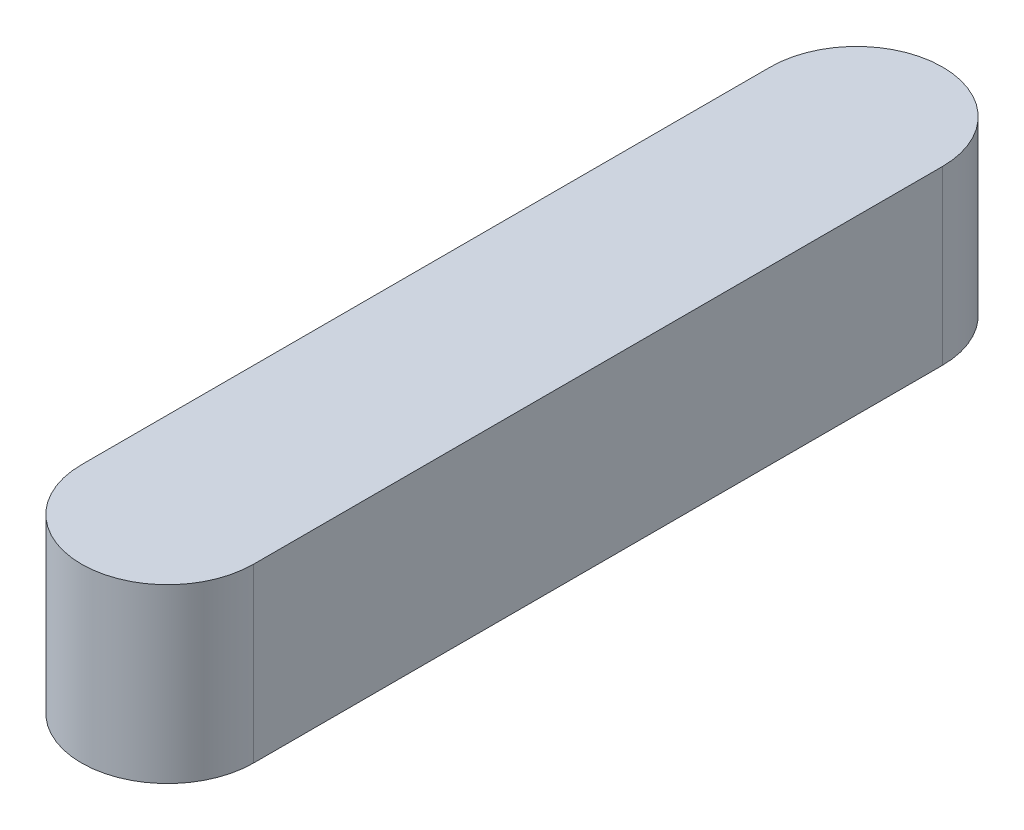
ISO-10303-21;
HEADER;
FILE_DESCRIPTION(('STEP AP214'),'2;1');
FILE_NAME('part.step','',(''),(''),'','','');
FILE_SCHEMA(('AUTOMOTIVE_DESIGN { 1 0 10303 214 1 1 1 1 }'));
ENDSEC;
DATA;
#1=APPLICATION_CONTEXT('core data for automotive mechanical design processes');
#2=APPLICATION_PROTOCOL_DEFINITION('international standard','automotive_design',2000,#1);
#3=PRODUCT_CONTEXT('',#1,'mechanical');
#4=PRODUCT('Part','Part','',(#3));
#5=PRODUCT_RELATED_PRODUCT_CATEGORY('part','',(#4));
#6=PRODUCT_DEFINITION_FORMATION('','',#4);
#7=PRODUCT_DEFINITION_CONTEXT('part definition',#1,'design');
#8=PRODUCT_DEFINITION('design','',#6,#7);
#9=PRODUCT_DEFINITION_SHAPE('','',#8);
#10=(LENGTH_UNIT() NAMED_UNIT(*) SI_UNIT(.MILLI.,.METRE.));
#11=(NAMED_UNIT(*) PLANE_ANGLE_UNIT() SI_UNIT($,.RADIAN.));
#12=(NAMED_UNIT(*) SI_UNIT($,.STERADIAN.) SOLID_ANGLE_UNIT());
#13=UNCERTAINTY_MEASURE_WITH_UNIT(LENGTH_MEASURE(1.E-05),#10,'distance_accuracy_value','');
#14=(GEOMETRIC_REPRESENTATION_CONTEXT(3) GLOBAL_UNCERTAINTY_ASSIGNED_CONTEXT((#13)) GLOBAL_UNIT_ASSIGNED_CONTEXT((#10,
#11,#12)) REPRESENTATION_CONTEXT('',''));
#15=CARTESIAN_POINT('',(0.,0.,0.));
#16=DIRECTION('',(0.,0.,1.));
#17=DIRECTION('',(1.,0.,0.));
#18=AXIS2_PLACEMENT_3D('',#15,#16,#17);
#19=CARTESIAN_POINT('',(0.,-2.,8.));
#20=DIRECTION('',(0.,1.,0.));
#21=DIRECTION('',(0.,0.,1.));
#22=AXIS2_PLACEMENT_3D('',#19,#20,#21);
#23=CYLINDRICAL_SURFACE('',#22,2.);
#24=CARTESIAN_POINT('',(0.,2.,8.));
#25=DIRECTION('',(0.,1.,0.));
#26=DIRECTION('',(0.,0.,1.));
#27=AXIS2_PLACEMENT_3D('',#24,#25,#26);
#28=CIRCLE('',#27,2.);
#29=CARTESIAN_POINT('',(-2.,2.,8.));
#30=VERTEX_POINT('',#29);
#31=CARTESIAN_POINT('',(2.,2.,8.));
#32=VERTEX_POINT('',#31);
#33=EDGE_CURVE('E101',#30,#32,#28,.T.);
#34=ORIENTED_EDGE('',*,*,#33,.F.);
#35=DIRECTION('',(0.,1.,0.));
#36=VECTOR('',#35,1.);
#37=CARTESIAN_POINT('',(-2.,-2.,8.));
#38=LINE('',#37,#36);
#39=CARTESIAN_POINT('',(-2.,-2.,8.));
#40=VERTEX_POINT('',#39);
#41=EDGE_CURVE('E11',#40,#30,#38,.T.);
#42=ORIENTED_EDGE('',*,*,#41,.F.);
#43=CARTESIAN_POINT('',(0.,-2.,8.));
#44=DIRECTION('',(0.,1.,0.));
#45=DIRECTION('',(0.,0.,1.));
#46=AXIS2_PLACEMENT_3D('',#43,#44,#45);
#47=CIRCLE('',#46,2.);
#48=CARTESIAN_POINT('',(2.,-2.,8.));
#49=VERTEX_POINT('',#48);
#50=EDGE_CURVE('E95',#40,#49,#47,.T.);
#51=ORIENTED_EDGE('',*,*,#50,.T.);
#52=DIRECTION('',(0.,1.,0.));
#53=VECTOR('',#52,1.);
#54=CARTESIAN_POINT('',(2.,-2.,8.));
#55=LINE('',#54,#53);
#56=EDGE_CURVE('E40',#49,#32,#55,.T.);
#57=ORIENTED_EDGE('',*,*,#56,.T.);
#58=EDGE_LOOP('',(#34,#42,#51,#57));
#59=FACE_BOUND('',#58,.T.);
#60=ADVANCED_FACE('F37',(#59),#23,.T.);
#61=CARTESIAN_POINT('',(-2.,-2.,8.));
#62=DIRECTION('',(-1.,0.,0.));
#63=DIRECTION('',(0.,0.,1.));
#64=AXIS2_PLACEMENT_3D('',#61,#62,#63);
#65=PLANE('',#64);
#66=DIRECTION('',(0.,0.,1.));
#67=VECTOR('',#66,1.);
#68=CARTESIAN_POINT('',(-2.,2.,8.));
#69=LINE('',#68,#67);
#70=CARTESIAN_POINT('',(-2.,2.,-8.));
#71=VERTEX_POINT('',#70);
#72=EDGE_CURVE('E97',#71,#30,#69,.T.);
#73=ORIENTED_EDGE('',*,*,#72,.F.);
#74=DIRECTION('',(0.,1.,0.));
#75=VECTOR('',#74,1.);
#76=CARTESIAN_POINT('',(-2.,-2.,-8.));
#77=LINE('',#76,#75);
#78=CARTESIAN_POINT('',(-2.,-2.,-8.));
#79=VERTEX_POINT('',#78);
#80=EDGE_CURVE('E46',#79,#71,#77,.T.);
#81=ORIENTED_EDGE('',*,*,#80,.F.);
#82=DIRECTION('',(0.,0.,1.));
#83=VECTOR('',#82,1.);
#84=CARTESIAN_POINT('',(-2.,-2.,8.));
#85=LINE('',#84,#83);
#86=EDGE_CURVE('E92',#79,#40,#85,.T.);
#87=ORIENTED_EDGE('',*,*,#86,.T.);
#88=ORIENTED_EDGE('',*,*,#41,.T.);
#89=EDGE_LOOP('',(#73,#81,#87,#88));
#90=FACE_BOUND('',#89,.T.);
#91=ADVANCED_FACE('F111',(#90),#65,.T.);
#92=CARTESIAN_POINT('',(0.,-2.,-8.));
#93=DIRECTION('',(0.,1.,0.));
#94=DIRECTION('',(0.,0.,1.));
#95=AXIS2_PLACEMENT_3D('',#92,#93,#94);
#96=CYLINDRICAL_SURFACE('',#95,2.);
#97=CARTESIAN_POINT('',(0.,2.,-8.));
#98=DIRECTION('',(0.,1.,0.));
#99=DIRECTION('',(0.,0.,1.));
#100=AXIS2_PLACEMENT_3D('',#97,#98,#99);
#101=CIRCLE('',#100,2.);
#102=CARTESIAN_POINT('',(2.,2.,-8.));
#103=VERTEX_POINT('',#102);
#104=EDGE_CURVE('E87',#103,#71,#101,.T.);
#105=ORIENTED_EDGE('',*,*,#104,.F.);
#106=DIRECTION('',(0.,1.,0.));
#107=VECTOR('',#106,1.);
#108=CARTESIAN_POINT('',(2.,-2.,-8.));
#109=LINE('',#108,#107);
#110=CARTESIAN_POINT('',(2.,-2.,-8.));
#111=VERTEX_POINT('',#110);
#112=EDGE_CURVE('E82',#111,#103,#109,.T.);
#113=ORIENTED_EDGE('',*,*,#112,.F.);
#114=CARTESIAN_POINT('',(0.,-2.,-8.));
#115=DIRECTION('',(0.,1.,0.));
#116=DIRECTION('',(0.,0.,1.));
#117=AXIS2_PLACEMENT_3D('',#114,#115,#116);
#118=CIRCLE('',#117,2.);
#119=EDGE_CURVE('E85',#111,#79,#118,.T.);
#120=ORIENTED_EDGE('',*,*,#119,.T.);
#121=ORIENTED_EDGE('',*,*,#80,.T.);
#122=EDGE_LOOP('',(#105,#113,#120,#121));
#123=FACE_BOUND('',#122,.T.);
#124=ADVANCED_FACE('F84',(#123),#96,.T.);
#125=CARTESIAN_POINT('',(2.,-2.,8.));
#126=DIRECTION('',(1.,0.,0.));
#127=DIRECTION('',(0.,0.,-1.));
#128=AXIS2_PLACEMENT_3D('',#125,#126,#127);
#129=PLANE('',#128);
#130=DIRECTION('',(0.,0.,-1.));
#131=VECTOR('',#130,1.);
#132=CARTESIAN_POINT('',(2.,2.,8.));
#133=LINE('',#132,#131);
#134=EDGE_CURVE('E104',#32,#103,#133,.T.);
#135=ORIENTED_EDGE('',*,*,#134,.F.);
#136=ORIENTED_EDGE('',*,*,#56,.F.);
#137=DIRECTION('',(0.,0.,-1.));
#138=VECTOR('',#137,1.);
#139=CARTESIAN_POINT('',(2.,-2.,8.));
#140=LINE('',#139,#138);
#141=EDGE_CURVE('E91',#49,#111,#140,.T.);
#142=ORIENTED_EDGE('',*,*,#141,.T.);
#143=ORIENTED_EDGE('',*,*,#112,.T.);
#144=EDGE_LOOP('',(#135,#136,#142,#143));
#145=FACE_BOUND('',#144,.T.);
#146=ADVANCED_FACE('F94',(#145),#129,.T.);
#147=CARTESIAN_POINT('',(0.,-2.,8.));
#148=DIRECTION('',(0.,1.,0.));
#149=DIRECTION('',(0.,0.,1.));
#150=AXIS2_PLACEMENT_3D('',#147,#148,#149);
#151=PLANE('',#150);
#152=ORIENTED_EDGE('',*,*,#50,.F.);
#153=ORIENTED_EDGE('',*,*,#86,.F.);
#154=ORIENTED_EDGE('',*,*,#119,.F.);
#155=ORIENTED_EDGE('',*,*,#141,.F.);
#156=EDGE_LOOP('',(#152,#153,#154,#155));
#157=FACE_BOUND('',#156,.T.);
#158=ADVANCED_FACE('F90',(#157),#151,.F.);
#159=CARTESIAN_POINT('',(0.,2.,8.));
#160=DIRECTION('',(0.,1.,0.));
#161=DIRECTION('',(0.,0.,1.));
#162=AXIS2_PLACEMENT_3D('',#159,#160,#161);
#163=PLANE('',#162);
#164=ORIENTED_EDGE('',*,*,#33,.T.);
#165=ORIENTED_EDGE('',*,*,#134,.T.);
#166=ORIENTED_EDGE('',*,*,#104,.T.);
#167=ORIENTED_EDGE('',*,*,#72,.T.);
#168=EDGE_LOOP('',(#164,#165,#166,#167));
#169=FACE_BOUND('',#168,.T.);
#170=ADVANCED_FACE('F110',(#169),#163,.T.);
#171=CLOSED_SHELL('',(#60,#91,#124,#146,#158,#170));
#172=MANIFOLD_SOLID_BREP('B2',#171);
#173=ADVANCED_BREP_SHAPE_REPRESENTATION('',(#18,#172),#14);
#174=SHAPE_DEFINITION_REPRESENTATION(#9,#173);
ENDSEC;
END-ISO-10303-21;
